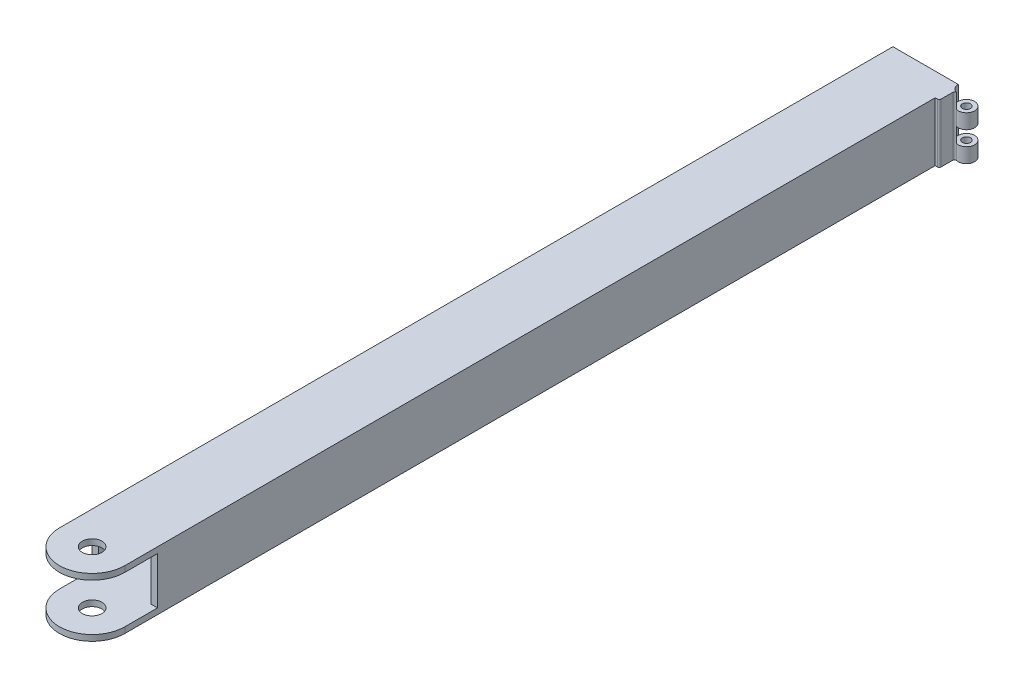
ISO-10303-21;
HEADER;
FILE_DESCRIPTION(('STEP AP214'),'2;1');
FILE_NAME('part.step','',(''),(''),'','','');
FILE_SCHEMA(('AUTOMOTIVE_DESIGN { 1 0 10303 214 1 1 1 1 }'));
ENDSEC;
DATA;
#1=APPLICATION_CONTEXT('core data for automotive mechanical design processes');
#2=APPLICATION_PROTOCOL_DEFINITION('international standard','automotive_design',2000,#1);
#3=PRODUCT_CONTEXT('',#1,'mechanical');
#4=PRODUCT('Part','Part','',(#3));
#5=PRODUCT_RELATED_PRODUCT_CATEGORY('part','',(#4));
#6=PRODUCT_DEFINITION_FORMATION('','',#4);
#7=PRODUCT_DEFINITION_CONTEXT('part definition',#1,'design');
#8=PRODUCT_DEFINITION('design','',#6,#7);
#9=PRODUCT_DEFINITION_SHAPE('','',#8);
#10=(LENGTH_UNIT() NAMED_UNIT(*) SI_UNIT(.MILLI.,.METRE.));
#11=(NAMED_UNIT(*) PLANE_ANGLE_UNIT() SI_UNIT($,.RADIAN.));
#12=(NAMED_UNIT(*) SI_UNIT($,.STERADIAN.) SOLID_ANGLE_UNIT());
#13=UNCERTAINTY_MEASURE_WITH_UNIT(LENGTH_MEASURE(1.E-05),#10,'distance_accuracy_value','');
#14=(GEOMETRIC_REPRESENTATION_CONTEXT(3) GLOBAL_UNCERTAINTY_ASSIGNED_CONTEXT((#13)) GLOBAL_UNIT_ASSIGNED_CONTEXT((#10,
#11,#12)) REPRESENTATION_CONTEXT('',''));
#15=CARTESIAN_POINT('',(0.,0.,0.));
#16=DIRECTION('',(0.,0.,1.));
#17=DIRECTION('',(1.,0.,0.));
#18=AXIS2_PLACEMENT_3D('',#15,#16,#17);
#19=CARTESIAN_POINT('',(25.,18.,0.));
#20=DIRECTION('',(0.,-1.,0.));
#21=DIRECTION('',(0.,0.,-1.));
#22=AXIS2_PLACEMENT_3D('',#19,#20,#21);
#23=CYLINDRICAL_SURFACE('',#22,5.);
#24=DIRECTION('',(0.,-1.,0.));
#25=VECTOR('',#24,1.);
#26=CARTESIAN_POINT('',(23.75,18.,4.84122918275927));
#27=LINE('',#26,#25);
#28=CARTESIAN_POINT('',(23.75,9.,4.84122918275927));
#29=VERTEX_POINT('',#28);
#30=CARTESIAN_POINT('',(23.75,0.,4.84122918275927));
#31=VERTEX_POINT('',#30);
#32=EDGE_CURVE('E215',#29,#31,#27,.T.);
#33=ORIENTED_EDGE('',*,*,#32,.T.);
#34=CARTESIAN_POINT('',(25.,0.,0.));
#35=DIRECTION('',(0.,-1.,0.));
#36=DIRECTION('',(0.,0.,-1.));
#37=AXIS2_PLACEMENT_3D('',#34,#35,#36);
#38=CIRCLE('',#37,5.);
#39=CARTESIAN_POINT('',(20.,0.,0.));
#40=VERTEX_POINT('',#39);
#41=EDGE_CURVE('E224',#40,#31,#38,.T.);
#42=ORIENTED_EDGE('',*,*,#41,.F.);
#43=DIRECTION('',(0.,1.,0.));
#44=VECTOR('',#43,1.);
#45=CARTESIAN_POINT('',(20.,18.,0.));
#46=LINE('',#45,#44);
#47=CARTESIAN_POINT('',(20.,9.,0.));
#48=VERTEX_POINT('',#47);
#49=EDGE_CURVE('E423',#40,#48,#46,.T.);
#50=ORIENTED_EDGE('',*,*,#49,.T.);
#51=CARTESIAN_POINT('',(25.,9.,0.));
#52=DIRECTION('',(0.,1.,0.));
#53=DIRECTION('',(0.,0.,1.));
#54=AXIS2_PLACEMENT_3D('',#51,#52,#53);
#55=CIRCLE('',#54,5.);
#56=EDGE_CURVE('E258',#29,#48,#55,.T.);
#57=ORIENTED_EDGE('',*,*,#56,.F.);
#58=EDGE_LOOP('',(#33,#42,#50,#57));
#59=FACE_BOUND('',#58,.T.);
#60=ADVANCED_FACE('F45',(#59),#23,.T.);
#61=CARTESIAN_POINT('',(25.,18.,0.));
#62=DIRECTION('',(0.,-1.,0.));
#63=DIRECTION('',(0.,0.,-1.));
#64=AXIS2_PLACEMENT_3D('',#61,#62,#63);
#65=CYLINDRICAL_SURFACE('',#64,2.5);
#66=CARTESIAN_POINT('',(25.,9.,0.));
#67=DIRECTION('',(0.,1.,0.));
#68=DIRECTION('',(0.,0.,1.));
#69=AXIS2_PLACEMENT_3D('',#66,#67,#68);
#70=CIRCLE('',#69,2.5);
#71=CARTESIAN_POINT('',(25.,9.,2.5));
#72=VERTEX_POINT('',#71);
#73=EDGE_CURVE('E650',#72,#72,#70,.F.);
#74=ORIENTED_EDGE('',*,*,#73,.F.);
#75=EDGE_LOOP('',(#74));
#76=FACE_BOUND('',#75,.T.);
#77=CARTESIAN_POINT('',(25.,0.,0.));
#78=DIRECTION('',(0.,-1.,0.));
#79=DIRECTION('',(0.,0.,-1.));
#80=AXIS2_PLACEMENT_3D('',#77,#78,#79);
#81=CIRCLE('',#80,2.5);
#82=CARTESIAN_POINT('',(25.,0.,-2.5));
#83=VERTEX_POINT('',#82);
#84=EDGE_CURVE('E665',#83,#83,#81,.F.);
#85=ORIENTED_EDGE('',*,*,#84,.F.);
#86=EDGE_LOOP('',(#85));
#87=FACE_BOUND('',#86,.T.);
#88=ADVANCED_FACE('F535',(#76,#87),#65,.F.);
#89=CARTESIAN_POINT('',(25.,-9.,0.));
#90=DIRECTION('',(0.,-1.,0.));
#91=DIRECTION('',(0.,0.,-1.));
#92=AXIS2_PLACEMENT_3D('',#89,#90,#91);
#93=CIRCLE('',#92,5.);
#94=CARTESIAN_POINT('',(20.,-9.,0.));
#95=VERTEX_POINT('',#94);
#96=CARTESIAN_POINT('',(23.75,-9.,4.84122918275927));
#97=VERTEX_POINT('',#96);
#98=EDGE_CURVE('E222',#95,#97,#93,.T.);
#99=ORIENTED_EDGE('',*,*,#98,.T.);
#100=CARTESIAN_POINT('',(23.75,-18.,4.84122918275927));
#101=VERTEX_POINT('',#100);
#102=EDGE_CURVE('E216',#97,#101,#27,.T.);
#103=ORIENTED_EDGE('',*,*,#102,.T.);
#104=CARTESIAN_POINT('',(25.,-18.,0.));
#105=DIRECTION('',(0.,-1.,0.));
#106=DIRECTION('',(0.,0.,-1.));
#107=AXIS2_PLACEMENT_3D('',#104,#105,#106);
#108=CIRCLE('',#107,5.);
#109=CARTESIAN_POINT('',(20.,-18.,0.));
#110=VERTEX_POINT('',#109);
#111=EDGE_CURVE('E309',#110,#101,#108,.T.);
#112=ORIENTED_EDGE('',*,*,#111,.F.);
#113=EDGE_CURVE('E231',#110,#95,#46,.T.);
#114=ORIENTED_EDGE('',*,*,#113,.T.);
#115=EDGE_LOOP('',(#99,#103,#112,#114));
#116=FACE_BOUND('',#115,.T.);
#117=ADVANCED_FACE('F228',(#116),#23,.T.);
#118=CARTESIAN_POINT('',(25.,-9.,0.));
#119=DIRECTION('',(0.,-1.,0.));
#120=DIRECTION('',(0.,0.,-1.));
#121=AXIS2_PLACEMENT_3D('',#118,#119,#120);
#122=CIRCLE('',#121,2.5);
#123=CARTESIAN_POINT('',(25.,-9.,-2.5));
#124=VERTEX_POINT('',#123);
#125=EDGE_CURVE('E669',#124,#124,#122,.F.);
#126=ORIENTED_EDGE('',*,*,#125,.T.);
#127=EDGE_LOOP('',(#126));
#128=FACE_BOUND('',#127,.T.);
#129=CARTESIAN_POINT('',(25.,-18.,0.));
#130=DIRECTION('',(0.,-1.,0.));
#131=DIRECTION('',(0.,0.,-1.));
#132=AXIS2_PLACEMENT_3D('',#129,#130,#131);
#133=CIRCLE('',#132,2.5);
#134=CARTESIAN_POINT('',(25.,-18.,-2.5));
#135=VERTEX_POINT('',#134);
#136=EDGE_CURVE('E306',#135,#135,#133,.T.);
#137=ORIENTED_EDGE('',*,*,#136,.T.);
#138=EDGE_LOOP('',(#137));
#139=FACE_BOUND('',#138,.T.);
#140=ADVANCED_FACE('F542',(#128,#139),#65,.F.);
#141=CARTESIAN_POINT('',(0.,14.4,510.));
#142=DIRECTION('',(0.,-1.,0.));
#143=DIRECTION('',(1.,0.,0.));
#144=AXIS2_PLACEMENT_3D('',#141,#142,#143);
#145=CYLINDRICAL_SURFACE('',#144,20.);
#146=DIRECTION('',(0.,1.,0.));
#147=VECTOR('',#146,1.);
#148=CARTESIAN_POINT('',(-20.,14.4,510.));
#149=LINE('',#148,#147);
#150=CARTESIAN_POINT('',(-20.,14.4,510.));
#151=VERTEX_POINT('',#150);
#152=CARTESIAN_POINT('',(-20.,18.,510.));
#153=VERTEX_POINT('',#152);
#154=EDGE_CURVE('E464',#151,#153,#149,.T.);
#155=ORIENTED_EDGE('',*,*,#154,.F.);
#156=CARTESIAN_POINT('',(0.,14.4,510.));
#157=DIRECTION('',(0.,-1.,0.));
#158=DIRECTION('',(0.,0.,-1.));
#159=AXIS2_PLACEMENT_3D('',#156,#157,#158);
#160=CIRCLE('',#159,20.);
#161=CARTESIAN_POINT('',(20.,14.4,510.));
#162=VERTEX_POINT('',#161);
#163=EDGE_CURVE('E472',#162,#151,#160,.T.);
#164=ORIENTED_EDGE('',*,*,#163,.F.);
#165=DIRECTION('',(0.,1.,0.));
#166=VECTOR('',#165,1.);
#167=CARTESIAN_POINT('',(20.,14.4,510.));
#168=LINE('',#167,#166);
#169=CARTESIAN_POINT('',(20.,18.,510.));
#170=VERTEX_POINT('',#169);
#171=EDGE_CURVE('E468',#170,#162,#168,.F.);
#172=ORIENTED_EDGE('',*,*,#171,.F.);
#173=CARTESIAN_POINT('',(0.,18.,510.));
#174=DIRECTION('',(0.,-1.,0.));
#175=DIRECTION('',(0.,0.,-1.));
#176=AXIS2_PLACEMENT_3D('',#173,#174,#175);
#177=CIRCLE('',#176,20.);
#178=EDGE_CURVE('E475',#153,#170,#177,.F.);
#179=ORIENTED_EDGE('',*,*,#178,.F.);
#180=EDGE_LOOP('',(#155,#164,#172,#179));
#181=FACE_BOUND('',#180,.T.);
#182=ADVANCED_FACE('F549',(#181),#145,.T.);
#183=CARTESIAN_POINT('',(0.,-18.,510.));
#184=DIRECTION('',(0.,-1.,0.));
#185=DIRECTION('',(1.,0.,0.));
#186=AXIS2_PLACEMENT_3D('',#183,#184,#185);
#187=CYLINDRICAL_SURFACE('',#186,20.);
#188=DIRECTION('',(0.,1.,0.));
#189=VECTOR('',#188,1.);
#190=CARTESIAN_POINT('',(-20.,-18.,510.));
#191=LINE('',#190,#189);
#192=CARTESIAN_POINT('',(-20.,-18.,510.));
#193=VERTEX_POINT('',#192);
#194=CARTESIAN_POINT('',(-20.,-14.4,510.));
#195=VERTEX_POINT('',#194);
#196=EDGE_CURVE('E450',#193,#195,#191,.T.);
#197=ORIENTED_EDGE('',*,*,#196,.F.);
#198=CARTESIAN_POINT('',(0.,-18.,510.));
#199=DIRECTION('',(0.,1.,0.));
#200=DIRECTION('',(0.,0.,1.));
#201=AXIS2_PLACEMENT_3D('',#198,#199,#200);
#202=CIRCLE('',#201,20.);
#203=CARTESIAN_POINT('',(20.,-18.,510.));
#204=VERTEX_POINT('',#203);
#205=EDGE_CURVE('E458',#204,#193,#202,.F.);
#206=ORIENTED_EDGE('',*,*,#205,.F.);
#207=DIRECTION('',(0.,1.,0.));
#208=VECTOR('',#207,1.);
#209=CARTESIAN_POINT('',(20.,-18.,510.));
#210=LINE('',#209,#208);
#211=CARTESIAN_POINT('',(20.,-14.4,510.));
#212=VERTEX_POINT('',#211);
#213=EDGE_CURVE('E454',#212,#204,#210,.F.);
#214=ORIENTED_EDGE('',*,*,#213,.F.);
#215=CARTESIAN_POINT('',(0.,-14.4,510.));
#216=DIRECTION('',(0.,1.,0.));
#217=DIRECTION('',(-1.,0.,0.));
#218=AXIS2_PLACEMENT_3D('',#215,#216,#217);
#219=CIRCLE('',#218,20.);
#220=EDGE_CURVE('E461',#195,#212,#219,.T.);
#221=ORIENTED_EDGE('',*,*,#220,.F.);
#222=EDGE_LOOP('',(#197,#206,#214,#221));
#223=FACE_BOUND('',#222,.T.);
#224=ADVANCED_FACE('F554',(#223),#187,.T.);
#225=CARTESIAN_POINT('',(0.,0.,0.));
#226=DIRECTION('',(0.,0.,1.));
#227=DIRECTION('',(1.,0.,0.));
#228=AXIS2_PLACEMENT_3D('',#225,#226,#227);
#229=PLANE('',#228);
#230=ORIENTED_EDGE('',*,*,#113,.F.);
#231=DIRECTION('',(1.,0.,0.));
#232=VECTOR('',#231,1.);
#233=CARTESIAN_POINT('',(-20.,-18.,0.));
#234=LINE('',#233,#232);
#235=CARTESIAN_POINT('',(-20.,-18.,0.));
#236=VERTEX_POINT('',#235);
#237=EDGE_CURVE('E434',#236,#110,#234,.T.);
#238=ORIENTED_EDGE('',*,*,#237,.F.);
#239=DIRECTION('',(0.,-1.,0.));
#240=VECTOR('',#239,1.);
#241=CARTESIAN_POINT('',(-20.,18.,0.));
#242=LINE('',#241,#240);
#243=CARTESIAN_POINT('',(-20.,18.,0.));
#244=VERTEX_POINT('',#243);
#245=EDGE_CURVE('E430',#244,#236,#242,.T.);
#246=ORIENTED_EDGE('',*,*,#245,.F.);
#247=DIRECTION('',(-1.,0.,0.));
#248=VECTOR('',#247,1.);
#249=CARTESIAN_POINT('',(-20.,18.,0.));
#250=LINE('',#249,#248);
#251=CARTESIAN_POINT('',(20.,18.,0.));
#252=VERTEX_POINT('',#251);
#253=EDGE_CURVE('E426',#252,#244,#250,.T.);
#254=ORIENTED_EDGE('',*,*,#253,.F.);
#255=DIRECTION('',(0.,1.,0.));
#256=VECTOR('',#255,1.);
#257=CARTESIAN_POINT('',(20.,9.,0.));
#258=LINE('',#257,#256);
#259=EDGE_CURVE('E648',#252,#48,#258,.F.);
#260=ORIENTED_EDGE('',*,*,#259,.T.);
#261=ORIENTED_EDGE('',*,*,#49,.F.);
#262=DIRECTION('',(0.,-1.,0.));
#263=VECTOR('',#262,1.);
#264=CARTESIAN_POINT('',(20.,0.,0.));
#265=LINE('',#264,#263);
#266=EDGE_CURVE('E661',#40,#95,#265,.T.);
#267=ORIENTED_EDGE('',*,*,#266,.T.);
#268=EDGE_LOOP('',(#230,#238,#246,#254,#260,#261,#267));
#269=FACE_BOUND('',#268,.T.);
#270=DIRECTION('',(0.,1.,0.));
#271=VECTOR('',#270,1.);
#272=CARTESIAN_POINT('',(16.,14.4,0.));
#273=LINE('',#272,#271);
#274=CARTESIAN_POINT('',(16.,-14.4,0.));
#275=VERTEX_POINT('',#274);
#276=CARTESIAN_POINT('',(16.,14.4,0.));
#277=VERTEX_POINT('',#276);
#278=EDGE_CURVE('E395',#275,#277,#273,.T.);
#279=ORIENTED_EDGE('',*,*,#278,.T.);
#280=DIRECTION('',(-1.,0.,0.));
#281=VECTOR('',#280,1.);
#282=CARTESIAN_POINT('',(-16.,14.4,0.));
#283=LINE('',#282,#281);
#284=CARTESIAN_POINT('',(-16.,14.4,0.));
#285=VERTEX_POINT('',#284);
#286=EDGE_CURVE('E399',#277,#285,#283,.T.);
#287=ORIENTED_EDGE('',*,*,#286,.T.);
#288=DIRECTION('',(0.,-1.,0.));
#289=VECTOR('',#288,1.);
#290=CARTESIAN_POINT('',(-16.,14.4,0.));
#291=LINE('',#290,#289);
#292=CARTESIAN_POINT('',(-16.,-14.4,0.));
#293=VERTEX_POINT('',#292);
#294=EDGE_CURVE('E403',#285,#293,#291,.T.);
#295=ORIENTED_EDGE('',*,*,#294,.T.);
#296=DIRECTION('',(1.,0.,0.));
#297=VECTOR('',#296,1.);
#298=CARTESIAN_POINT('',(-16.,-14.4,0.));
#299=LINE('',#298,#297);
#300=EDGE_CURVE('E407',#293,#275,#299,.T.);
#301=ORIENTED_EDGE('',*,*,#300,.T.);
#302=EDGE_LOOP('',(#279,#287,#295,#301));
#303=FACE_BOUND('',#302,.T.);
#304=ADVANCED_FACE('F580',(#269,#303),#229,.F.);
#305=CARTESIAN_POINT('',(20.,18.,530.));
#306=DIRECTION('',(-1.,0.,0.));
#307=DIRECTION('',(0.,-1.,0.));
#308=AXIS2_PLACEMENT_3D('',#305,#306,#307);
#309=PLANE('',#308);
#310=DIRECTION('',(0.,0.,-1.));
#311=VECTOR('',#310,1.);
#312=CARTESIAN_POINT('',(20.,-18.,530.));
#313=LINE('',#312,#311);
#314=CARTESIAN_POINT('',(20.,-18.,14.1206935243212));
#315=VERTEX_POINT('',#314);
#316=EDGE_CURVE('E438',#204,#315,#313,.T.);
#317=ORIENTED_EDGE('',*,*,#316,.T.);
#318=DIRECTION('',(0.,-1.,0.));
#319=VECTOR('',#318,1.);
#320=CARTESIAN_POINT('',(20.,18.,14.1206935243212));
#321=LINE('',#320,#319);
#322=CARTESIAN_POINT('',(20.,18.,14.1206935243212));
#323=VERTEX_POINT('',#322);
#324=EDGE_CURVE('E290',#323,#315,#321,.T.);
#325=ORIENTED_EDGE('',*,*,#324,.F.);
#326=DIRECTION('',(0.,0.,-1.));
#327=VECTOR('',#326,1.);
#328=CARTESIAN_POINT('',(20.,18.,530.));
#329=LINE('',#328,#327);
#330=EDGE_CURVE('E447',#170,#323,#329,.T.);
#331=ORIENTED_EDGE('',*,*,#330,.F.);
#332=ORIENTED_EDGE('',*,*,#171,.T.);
#333=DIRECTION('',(0.,0.,-1.));
#334=VECTOR('',#333,1.);
#335=CARTESIAN_POINT('',(20.,14.4,530.));
#336=LINE('',#335,#334);
#337=CARTESIAN_POINT('',(20.,14.4,490.));
#338=VERTEX_POINT('',#337);
#339=EDGE_CURVE('E385',#162,#338,#336,.T.);
#340=ORIENTED_EDGE('',*,*,#339,.T.);
#341=DIRECTION('',(0.,-1.,0.));
#342=VECTOR('',#341,1.);
#343=CARTESIAN_POINT('',(20.,18.,490.));
#344=LINE('',#343,#342);
#345=CARTESIAN_POINT('',(20.,-14.4,490.));
#346=VERTEX_POINT('',#345);
#347=EDGE_CURVE('E377',#338,#346,#344,.T.);
#348=ORIENTED_EDGE('',*,*,#347,.T.);
#349=DIRECTION('',(0.,0.,1.));
#350=VECTOR('',#349,1.);
#351=CARTESIAN_POINT('',(20.,-14.4,530.));
#352=LINE('',#351,#350);
#353=EDGE_CURVE('E391',#346,#212,#352,.T.);
#354=ORIENTED_EDGE('',*,*,#353,.T.);
#355=ORIENTED_EDGE('',*,*,#213,.T.);
#356=EDGE_LOOP('',(#317,#325,#331,#332,#340,#348,#354,#355));
#357=FACE_BOUND('',#356,.T.);
#358=ADVANCED_FACE('F582',(#357),#309,.F.);
#359=CARTESIAN_POINT('',(-20.,18.,530.));
#360=DIRECTION('',(0.,-1.,0.));
#361=DIRECTION('',(0.,0.,-1.));
#362=AXIS2_PLACEMENT_3D('',#359,#360,#361);
#363=PLANE('',#362);
#364=CARTESIAN_POINT('',(0.,18.,510.));
#365=DIRECTION('',(0.,-1.,0.));
#366=DIRECTION('',(0.,0.,-1.));
#367=AXIS2_PLACEMENT_3D('',#364,#365,#366);
#368=CIRCLE('',#367,6.);
#369=CARTESIAN_POINT('',(0.,18.,504.));
#370=VERTEX_POINT('',#369);
#371=EDGE_CURVE('E353',#370,#370,#368,.T.);
#372=ORIENTED_EDGE('',*,*,#371,.T.);
#373=EDGE_LOOP('',(#372));
#374=FACE_BOUND('',#373,.T.);
#375=CARTESIAN_POINT('',(23.5,18.,5.80947501931113));
#376=DIRECTION('',(0.,-1.,0.));
#377=DIRECTION('',(0.,0.,-1.));
#378=AXIS2_PLACEMENT_3D('',#375,#376,#377);
#379=CIRCLE('',#378,1.);
#380=CARTESIAN_POINT('',(22.5,18.,5.80947501931113));
#381=VERTEX_POINT('',#380);
#382=CARTESIAN_POINT('',(23.75,18.,4.84122918275927));
#383=VERTEX_POINT('',#382);
#384=EDGE_CURVE('E260',#381,#383,#379,.T.);
#385=ORIENTED_EDGE('',*,*,#384,.T.);
#386=CARTESIAN_POINT('',(25.,18.,0.));
#387=DIRECTION('',(0.,1.,0.));
#388=DIRECTION('',(0.,0.,1.));
#389=AXIS2_PLACEMENT_3D('',#386,#387,#388);
#390=CIRCLE('',#389,5.);
#391=EDGE_CURVE('E646',#252,#383,#390,.T.);
#392=ORIENTED_EDGE('',*,*,#391,.F.);
#393=ORIENTED_EDGE('',*,*,#253,.T.);
#394=DIRECTION('',(0.,0.,-1.));
#395=VECTOR('',#394,1.);
#396=CARTESIAN_POINT('',(-20.,18.,530.));
#397=LINE('',#396,#395);
#398=EDGE_CURVE('E444',#153,#244,#397,.T.);
#399=ORIENTED_EDGE('',*,*,#398,.F.);
#400=ORIENTED_EDGE('',*,*,#178,.T.);
#401=ORIENTED_EDGE('',*,*,#330,.T.);
#402=DIRECTION('',(-1.,0.,0.));
#403=VECTOR('',#402,1.);
#404=CARTESIAN_POINT('',(20.,18.,14.1206935243212));
#405=LINE('',#404,#403);
#406=CARTESIAN_POINT('',(21.5,18.,14.1206935243212));
#407=VERTEX_POINT('',#406);
#408=EDGE_CURVE('E298',#407,#323,#405,.T.);
#409=ORIENTED_EDGE('',*,*,#408,.F.);
#410=CARTESIAN_POINT('',(21.5,18.,13.1206935243212));
#411=DIRECTION('',(0.,-1.,0.));
#412=DIRECTION('',(0.,0.,-1.));
#413=AXIS2_PLACEMENT_3D('',#410,#411,#412);
#414=CIRCLE('',#413,1.);
#415=CARTESIAN_POINT('',(22.5,18.,13.1206935243212));
#416=VERTEX_POINT('',#415);
#417=EDGE_CURVE('E11',#407,#416,#414,.F.);
#418=ORIENTED_EDGE('',*,*,#417,.T.);
#419=DIRECTION('',(0.,0.,1.));
#420=VECTOR('',#419,1.);
#421=CARTESIAN_POINT('',(22.5,18.,14.1206935243212));
#422=LINE('',#421,#420);
#423=EDGE_CURVE('E292',#381,#416,#422,.T.);
#424=ORIENTED_EDGE('',*,*,#423,.F.);
#425=EDGE_LOOP('',(#385,#392,#393,#399,#400,#401,#409,#418,#424));
#426=FACE_BOUND('',#425,.T.);
#427=ADVANCED_FACE('F296',(#374,#426),#363,.F.);
#428=CARTESIAN_POINT('',(-20.,18.,530.));
#429=DIRECTION('',(1.,0.,0.));
#430=DIRECTION('',(0.,1.,0.));
#431=AXIS2_PLACEMENT_3D('',#428,#429,#430);
#432=PLANE('',#431);
#433=DIRECTION('',(0.,0.,1.));
#434=VECTOR('',#433,1.);
#435=CARTESIAN_POINT('',(-20.,14.4,530.));
#436=LINE('',#435,#434);
#437=CARTESIAN_POINT('',(-20.,14.4,490.));
#438=VERTEX_POINT('',#437);
#439=EDGE_CURVE('E381',#438,#151,#436,.T.);
#440=ORIENTED_EDGE('',*,*,#439,.T.);
#441=ORIENTED_EDGE('',*,*,#154,.T.);
#442=ORIENTED_EDGE('',*,*,#398,.T.);
#443=ORIENTED_EDGE('',*,*,#245,.T.);
#444=DIRECTION('',(0.,0.,-1.));
#445=VECTOR('',#444,1.);
#446=CARTESIAN_POINT('',(-20.,-18.,530.));
#447=LINE('',#446,#445);
#448=EDGE_CURVE('E441',#193,#236,#447,.T.);
#449=ORIENTED_EDGE('',*,*,#448,.F.);
#450=ORIENTED_EDGE('',*,*,#196,.T.);
#451=DIRECTION('',(0.,0.,-1.));
#452=VECTOR('',#451,1.);
#453=CARTESIAN_POINT('',(-20.,-14.4,530.));
#454=LINE('',#453,#452);
#455=CARTESIAN_POINT('',(-20.,-14.4,490.));
#456=VERTEX_POINT('',#455);
#457=EDGE_CURVE('E388',#195,#456,#454,.T.);
#458=ORIENTED_EDGE('',*,*,#457,.T.);
#459=DIRECTION('',(0.,1.,0.));
#460=VECTOR('',#459,1.);
#461=CARTESIAN_POINT('',(-20.,18.,490.));
#462=LINE('',#461,#460);
#463=EDGE_CURVE('E373',#456,#438,#462,.T.);
#464=ORIENTED_EDGE('',*,*,#463,.T.);
#465=EDGE_LOOP('',(#440,#441,#442,#443,#449,#450,#458,#464));
#466=FACE_BOUND('',#465,.T.);
#467=ADVANCED_FACE('F515',(#466),#432,.F.);
#468=CARTESIAN_POINT('',(-20.,-18.,530.));
#469=DIRECTION('',(0.,1.,0.));
#470=DIRECTION('',(0.,0.,1.));
#471=AXIS2_PLACEMENT_3D('',#468,#469,#470);
#472=PLANE('',#471);
#473=CARTESIAN_POINT('',(0.,-18.,360.));
#474=DIRECTION('',(0.,-1.,0.));
#475=DIRECTION('',(0.,0.,-1.));
#476=AXIS2_PLACEMENT_3D('',#473,#474,#475);
#477=CIRCLE('',#476,6.);
#478=CARTESIAN_POINT('',(-5.99999999999999,-18.,360.));
#479=VERTEX_POINT('',#478);
#480=CARTESIAN_POINT('',(6.,-18.,360.));
#481=VERTEX_POINT('',#480);
#482=EDGE_CURVE('E319',#479,#481,#477,.T.);
#483=ORIENTED_EDGE('',*,*,#482,.F.);
#484=DIRECTION('',(0.,0.,-1.));
#485=VECTOR('',#484,1.);
#486=CARTESIAN_POINT('',(-5.99999999999993,-18.,0.));
#487=LINE('',#486,#485);
#488=CARTESIAN_POINT('',(-6.,-18.,460.));
#489=VERTEX_POINT('',#488);
#490=EDGE_CURVE('E316',#489,#479,#487,.T.);
#491=ORIENTED_EDGE('',*,*,#490,.F.);
#492=CARTESIAN_POINT('',(0.,-18.,460.));
#493=DIRECTION('',(0.,-1.,0.));
#494=DIRECTION('',(0.,0.,-1.));
#495=AXIS2_PLACEMENT_3D('',#492,#493,#494);
#496=CIRCLE('',#495,6.00000000000001);
#497=CARTESIAN_POINT('',(6.00000000000001,-18.,460.));
#498=VERTEX_POINT('',#497);
#499=EDGE_CURVE('E327',#498,#489,#496,.T.);
#500=ORIENTED_EDGE('',*,*,#499,.F.);
#501=DIRECTION('',(0.,0.,-1.));
#502=VECTOR('',#501,1.);
#503=CARTESIAN_POINT('',(5.99999999999993,-18.,0.));
#504=LINE('',#503,#502);
#505=EDGE_CURVE('E323',#498,#481,#504,.T.);
#506=ORIENTED_EDGE('',*,*,#505,.T.);
#507=EDGE_LOOP('',(#483,#491,#500,#506));
#508=FACE_BOUND('',#507,.T.);
#509=CARTESIAN_POINT('',(0.,-18.,510.));
#510=DIRECTION('',(0.,1.,0.));
#511=DIRECTION('',(0.,0.,1.));
#512=AXIS2_PLACEMENT_3D('',#509,#510,#511);
#513=CIRCLE('',#512,6.);
#514=CARTESIAN_POINT('',(0.,-18.,516.));
#515=VERTEX_POINT('',#514);
#516=EDGE_CURVE('E335',#515,#515,#513,.T.);
#517=ORIENTED_EDGE('',*,*,#516,.T.);
#518=EDGE_LOOP('',(#517));
#519=FACE_BOUND('',#518,.T.);
#520=DIRECTION('',(0.,0.,1.));
#521=VECTOR('',#520,1.);
#522=CARTESIAN_POINT('',(22.5,-18.,14.1206935243212));
#523=LINE('',#522,#521);
#524=CARTESIAN_POINT('',(22.5,-18.,5.80947501931113));
#525=VERTEX_POINT('',#524);
#526=CARTESIAN_POINT('',(22.5,-18.,13.1206935243212));
#527=VERTEX_POINT('',#526);
#528=EDGE_CURVE('E284',#525,#527,#523,.T.);
#529=ORIENTED_EDGE('',*,*,#528,.T.);
#530=CARTESIAN_POINT('',(21.5,-18.,13.1206935243212));
#531=DIRECTION('',(0.,1.,0.));
#532=DIRECTION('',(0.,0.,1.));
#533=AXIS2_PLACEMENT_3D('',#530,#531,#532);
#534=CIRCLE('',#533,1.);
#535=CARTESIAN_POINT('',(21.5,-18.,14.1206935243212));
#536=VERTEX_POINT('',#535);
#537=EDGE_CURVE('E270',#527,#536,#534,.F.);
#538=ORIENTED_EDGE('',*,*,#537,.T.);
#539=DIRECTION('',(-1.,0.,0.));
#540=VECTOR('',#539,1.);
#541=CARTESIAN_POINT('',(20.,-18.,14.1206935243212));
#542=LINE('',#541,#540);
#543=EDGE_CURVE('E281',#536,#315,#542,.T.);
#544=ORIENTED_EDGE('',*,*,#543,.T.);
#545=ORIENTED_EDGE('',*,*,#316,.F.);
#546=ORIENTED_EDGE('',*,*,#205,.T.);
#547=ORIENTED_EDGE('',*,*,#448,.T.);
#548=ORIENTED_EDGE('',*,*,#237,.T.);
#549=ORIENTED_EDGE('',*,*,#111,.T.);
#550=CARTESIAN_POINT('',(23.5,-18.,5.80947501931113));
#551=DIRECTION('',(0.,1.,0.));
#552=DIRECTION('',(0.,0.,1.));
#553=AXIS2_PLACEMENT_3D('',#550,#551,#552);
#554=CIRCLE('',#553,1.);
#555=EDGE_CURVE('E236',#101,#525,#554,.T.);
#556=ORIENTED_EDGE('',*,*,#555,.T.);
#557=EDGE_LOOP('',(#529,#538,#544,#545,#546,#547,#548,#549,#556));
#558=FACE_BOUND('',#557,.T.);
#559=ORIENTED_EDGE('',*,*,#136,.F.);
#560=EDGE_LOOP('',(#559));
#561=FACE_BOUND('',#560,.T.);
#562=ADVANCED_FACE('F278',(#508,#519,#558,#561),#472,.F.);
#563=CARTESIAN_POINT('',(16.,14.4,530.));
#564=DIRECTION('',(-1.,0.,0.));
#565=DIRECTION('',(0.,-1.,0.));
#566=AXIS2_PLACEMENT_3D('',#563,#564,#565);
#567=PLANE('',#566);
#568=DIRECTION('',(0.,-1.,0.));
#569=VECTOR('',#568,1.);
#570=CARTESIAN_POINT('',(16.,14.4,490.));
#571=LINE('',#570,#569);
#572=CARTESIAN_POINT('',(16.,14.4,490.));
#573=VERTEX_POINT('',#572);
#574=CARTESIAN_POINT('',(16.,-14.4,490.));
#575=VERTEX_POINT('',#574);
#576=EDGE_CURVE('E370',#573,#575,#571,.T.);
#577=ORIENTED_EDGE('',*,*,#576,.F.);
#578=DIRECTION('',(0.,0.,-1.));
#579=VECTOR('',#578,1.);
#580=CARTESIAN_POINT('',(16.,14.4,530.));
#581=LINE('',#580,#579);
#582=EDGE_CURVE('E420',#573,#277,#581,.T.);
#583=ORIENTED_EDGE('',*,*,#582,.T.);
#584=ORIENTED_EDGE('',*,*,#278,.F.);
#585=DIRECTION('',(0.,0.,-1.));
#586=VECTOR('',#585,1.);
#587=CARTESIAN_POINT('',(16.,-14.4,530.));
#588=LINE('',#587,#586);
#589=EDGE_CURVE('E411',#575,#275,#588,.T.);
#590=ORIENTED_EDGE('',*,*,#589,.F.);
#591=EDGE_LOOP('',(#577,#583,#584,#590));
#592=FACE_BOUND('',#591,.T.);
#593=ADVANCED_FACE('F514',(#592),#567,.T.);
#594=CARTESIAN_POINT('',(-16.,14.4,530.));
#595=DIRECTION('',(0.,-1.,0.));
#596=DIRECTION('',(0.,0.,-1.));
#597=AXIS2_PLACEMENT_3D('',#594,#595,#596);
#598=PLANE('',#597);
#599=CARTESIAN_POINT('',(0.,14.4,510.));
#600=DIRECTION('',(0.,-1.,0.));
#601=DIRECTION('',(0.,0.,-1.));
#602=AXIS2_PLACEMENT_3D('',#599,#600,#601);
#603=CIRCLE('',#602,6.);
#604=CARTESIAN_POINT('',(0.,14.4,504.));
#605=VERTEX_POINT('',#604);
#606=EDGE_CURVE('E349',#605,#605,#603,.T.);
#607=ORIENTED_EDGE('',*,*,#606,.F.);
#608=EDGE_LOOP('',(#607));
#609=FACE_BOUND('',#608,.T.);
#610=ORIENTED_EDGE('',*,*,#339,.F.);
#611=ORIENTED_EDGE('',*,*,#163,.T.);
#612=ORIENTED_EDGE('',*,*,#439,.F.);
#613=DIRECTION('',(-1.,0.,0.));
#614=VECTOR('',#613,1.);
#615=CARTESIAN_POINT('',(-25.,14.4,490.));
#616=LINE('',#615,#614);
#617=CARTESIAN_POINT('',(-16.,14.4,490.));
#618=VERTEX_POINT('',#617);
#619=EDGE_CURVE('E357',#618,#438,#616,.T.);
#620=ORIENTED_EDGE('',*,*,#619,.F.);
#621=DIRECTION('',(0.,0.,-1.));
#622=VECTOR('',#621,1.);
#623=CARTESIAN_POINT('',(-16.,14.4,530.));
#624=LINE('',#623,#622);
#625=EDGE_CURVE('E417',#618,#285,#624,.T.);
#626=ORIENTED_EDGE('',*,*,#625,.T.);
#627=ORIENTED_EDGE('',*,*,#286,.F.);
#628=ORIENTED_EDGE('',*,*,#582,.F.);
#629=EDGE_CURVE('E361',#338,#573,#616,.T.);
#630=ORIENTED_EDGE('',*,*,#629,.F.);
#631=EDGE_LOOP('',(#610,#611,#612,#620,#626,#627,#628,#630));
#632=FACE_BOUND('',#631,.T.);
#633=ADVANCED_FACE('F597',(#609,#632),#598,.T.);
#634=CARTESIAN_POINT('',(-16.,14.4,530.));
#635=DIRECTION('',(1.,0.,0.));
#636=DIRECTION('',(0.,1.,0.));
#637=AXIS2_PLACEMENT_3D('',#634,#635,#636);
#638=PLANE('',#637);
#639=DIRECTION('',(0.,1.,0.));
#640=VECTOR('',#639,1.);
#641=CARTESIAN_POINT('',(-16.,14.4,490.));
#642=LINE('',#641,#640);
#643=CARTESIAN_POINT('',(-16.,-14.4,490.));
#644=VERTEX_POINT('',#643);
#645=EDGE_CURVE('E367',#644,#618,#642,.T.);
#646=ORIENTED_EDGE('',*,*,#645,.F.);
#647=DIRECTION('',(0.,0.,-1.));
#648=VECTOR('',#647,1.);
#649=CARTESIAN_POINT('',(-16.,-14.4,530.));
#650=LINE('',#649,#648);
#651=EDGE_CURVE('E414',#644,#293,#650,.T.);
#652=ORIENTED_EDGE('',*,*,#651,.T.);
#653=ORIENTED_EDGE('',*,*,#294,.F.);
#654=ORIENTED_EDGE('',*,*,#625,.F.);
#655=EDGE_LOOP('',(#646,#652,#653,#654));
#656=FACE_BOUND('',#655,.T.);
#657=ADVANCED_FACE('F601',(#656),#638,.T.);
#658=CARTESIAN_POINT('',(-16.,-14.4,530.));
#659=DIRECTION('',(0.,1.,0.));
#660=DIRECTION('',(-1.,0.,0.));
#661=AXIS2_PLACEMENT_3D('',#658,#659,#660);
#662=PLANE('',#661);
#663=DIRECTION('',(0.,0.,1.));
#664=VECTOR('',#663,1.);
#665=CARTESIAN_POINT('',(-6.,-14.4,530.));
#666=LINE('',#665,#664);
#667=CARTESIAN_POINT('',(-5.99999999999999,-14.4,360.));
#668=VERTEX_POINT('',#667);
#669=CARTESIAN_POINT('',(-6.,-14.4,460.));
#670=VERTEX_POINT('',#669);
#671=EDGE_CURVE('E239',#668,#670,#666,.T.);
#672=ORIENTED_EDGE('',*,*,#671,.F.);
#673=CARTESIAN_POINT('',(0.,-14.4,360.));
#674=DIRECTION('',(0.,1.,0.));
#675=DIRECTION('',(-1.,0.,0.));
#676=AXIS2_PLACEMENT_3D('',#673,#674,#675);
#677=CIRCLE('',#676,6.);
#678=CARTESIAN_POINT('',(6.00000000000002,-14.4,360.));
#679=VERTEX_POINT('',#678);
#680=EDGE_CURVE('E478',#679,#668,#677,.T.);
#681=ORIENTED_EDGE('',*,*,#680,.F.);
#682=DIRECTION('',(0.,0.,1.));
#683=VECTOR('',#682,1.);
#684=CARTESIAN_POINT('',(6.,-14.4,530.));
#685=LINE('',#684,#683);
#686=CARTESIAN_POINT('',(6.00000000000001,-14.4,460.));
#687=VERTEX_POINT('',#686);
#688=EDGE_CURVE('E484',#679,#687,#685,.T.);
#689=ORIENTED_EDGE('',*,*,#688,.T.);
#690=CARTESIAN_POINT('',(0.,-14.4,460.));
#691=DIRECTION('',(0.,1.,0.));
#692=DIRECTION('',(-1.,0.,0.));
#693=AXIS2_PLACEMENT_3D('',#690,#691,#692);
#694=CIRCLE('',#693,6.00000000000001);
#695=EDGE_CURVE('E242',#670,#687,#694,.T.);
#696=ORIENTED_EDGE('',*,*,#695,.F.);
#697=EDGE_LOOP('',(#672,#681,#689,#696));
#698=FACE_BOUND('',#697,.T.);
#699=CARTESIAN_POINT('',(0.,-14.4,510.));
#700=DIRECTION('',(0.,1.,0.));
#701=DIRECTION('',(-1.,0.,0.));
#702=AXIS2_PLACEMENT_3D('',#699,#700,#701);
#703=CIRCLE('',#702,6.);
#704=CARTESIAN_POINT('',(-6.,-14.4,510.));
#705=VERTEX_POINT('',#704);
#706=EDGE_CURVE('E348',#705,#705,#703,.T.);
#707=ORIENTED_EDGE('',*,*,#706,.F.);
#708=EDGE_LOOP('',(#707));
#709=FACE_BOUND('',#708,.T.);
#710=ORIENTED_EDGE('',*,*,#457,.F.);
#711=ORIENTED_EDGE('',*,*,#220,.T.);
#712=ORIENTED_EDGE('',*,*,#353,.F.);
#713=DIRECTION('',(1.,0.,0.));
#714=VECTOR('',#713,1.);
#715=CARTESIAN_POINT('',(-25.,-14.4,490.));
#716=LINE('',#715,#714);
#717=EDGE_CURVE('E362',#575,#346,#716,.T.);
#718=ORIENTED_EDGE('',*,*,#717,.F.);
#719=ORIENTED_EDGE('',*,*,#589,.T.);
#720=ORIENTED_EDGE('',*,*,#300,.F.);
#721=ORIENTED_EDGE('',*,*,#651,.F.);
#722=EDGE_CURVE('E366',#456,#644,#716,.T.);
#723=ORIENTED_EDGE('',*,*,#722,.F.);
#724=EDGE_LOOP('',(#710,#711,#712,#718,#719,#720,#721,#723));
#725=FACE_BOUND('',#724,.T.);
#726=ADVANCED_FACE('F502',(#698,#709,#725),#662,.T.);
#727=CARTESIAN_POINT('',(0.,0.,490.));
#728=DIRECTION('',(0.,0.,-1.));
#729=DIRECTION('',(-1.,0.,0.));
#730=AXIS2_PLACEMENT_3D('',#727,#728,#729);
#731=PLANE('',#730);
#732=ORIENTED_EDGE('',*,*,#722,.T.);
#733=ORIENTED_EDGE('',*,*,#645,.T.);
#734=ORIENTED_EDGE('',*,*,#619,.T.);
#735=ORIENTED_EDGE('',*,*,#463,.F.);
#736=EDGE_LOOP('',(#732,#733,#734,#735));
#737=FACE_BOUND('',#736,.T.);
#738=ADVANCED_FACE('F530',(#737),#731,.F.);
#739=ORIENTED_EDGE('',*,*,#629,.T.);
#740=ORIENTED_EDGE('',*,*,#576,.T.);
#741=ORIENTED_EDGE('',*,*,#717,.T.);
#742=ORIENTED_EDGE('',*,*,#347,.F.);
#743=EDGE_LOOP('',(#739,#740,#741,#742));
#744=FACE_BOUND('',#743,.T.);
#745=ADVANCED_FACE('F522',(#744),#731,.F.);
#746=CARTESIAN_POINT('',(0.,-18.,510.));
#747=DIRECTION('',(0.,1.,0.));
#748=DIRECTION('',(0.,0.,1.));
#749=AXIS2_PLACEMENT_3D('',#746,#747,#748);
#750=CYLINDRICAL_SURFACE('',#749,6.);
#751=ORIENTED_EDGE('',*,*,#706,.T.);
#752=EDGE_LOOP('',(#751));
#753=FACE_BOUND('',#752,.T.);
#754=ORIENTED_EDGE('',*,*,#516,.F.);
#755=EDGE_LOOP('',(#754));
#756=FACE_BOUND('',#755,.T.);
#757=ADVANCED_FACE('F519',(#753,#756),#750,.F.);
#758=ORIENTED_EDGE('',*,*,#606,.T.);
#759=EDGE_LOOP('',(#758));
#760=FACE_BOUND('',#759,.T.);
#761=ORIENTED_EDGE('',*,*,#371,.F.);
#762=EDGE_LOOP('',(#761));
#763=FACE_BOUND('',#762,.T.);
#764=ADVANCED_FACE('F521',(#760,#763),#750,.F.);
#765=CARTESIAN_POINT('',(-5.99999999999993,-8.,0.));
#766=DIRECTION('',(-1.,0.,0.));
#767=DIRECTION('',(0.,0.,1.));
#768=AXIS2_PLACEMENT_3D('',#765,#766,#767);
#769=PLANE('',#768);
#770=ORIENTED_EDGE('',*,*,#671,.T.);
#771=DIRECTION('',(0.,-1.,0.));
#772=VECTOR('',#771,1.);
#773=CARTESIAN_POINT('',(-6.,-8.,460.));
#774=LINE('',#773,#772);
#775=EDGE_CURVE('E332',#670,#489,#774,.T.);
#776=ORIENTED_EDGE('',*,*,#775,.T.);
#777=ORIENTED_EDGE('',*,*,#490,.T.);
#778=DIRECTION('',(0.,-1.,0.));
#779=VECTOR('',#778,1.);
#780=CARTESIAN_POINT('',(-5.99999999999999,-8.,360.));
#781=LINE('',#780,#779);
#782=EDGE_CURVE('E331',#668,#479,#781,.T.);
#783=ORIENTED_EDGE('',*,*,#782,.F.);
#784=EDGE_LOOP('',(#770,#776,#777,#783));
#785=FACE_BOUND('',#784,.T.);
#786=ADVANCED_FACE('F509',(#785),#769,.F.);
#787=CARTESIAN_POINT('',(0.,-8.,460.));
#788=DIRECTION('',(0.,-1.,0.));
#789=DIRECTION('',(0.,0.,-1.));
#790=AXIS2_PLACEMENT_3D('',#787,#788,#789);
#791=CYLINDRICAL_SURFACE('',#790,6.00000000000001);
#792=ORIENTED_EDGE('',*,*,#695,.T.);
#793=DIRECTION('',(0.,-1.,0.));
#794=VECTOR('',#793,1.);
#795=CARTESIAN_POINT('',(6.00000000000001,-8.,460.));
#796=LINE('',#795,#794);
#797=EDGE_CURVE('E336',#687,#498,#796,.T.);
#798=ORIENTED_EDGE('',*,*,#797,.T.);
#799=ORIENTED_EDGE('',*,*,#499,.T.);
#800=ORIENTED_EDGE('',*,*,#775,.F.);
#801=EDGE_LOOP('',(#792,#798,#799,#800));
#802=FACE_BOUND('',#801,.T.);
#803=ADVANCED_FACE('F493',(#802),#791,.F.);
#804=CARTESIAN_POINT('',(5.99999999999993,-8.,0.));
#805=DIRECTION('',(-1.,0.,0.));
#806=DIRECTION('',(0.,0.,1.));
#807=AXIS2_PLACEMENT_3D('',#804,#805,#806);
#808=PLANE('',#807);
#809=DIRECTION('',(0.,-1.,0.));
#810=VECTOR('',#809,1.);
#811=CARTESIAN_POINT('',(6.,-8.,360.));
#812=LINE('',#811,#810);
#813=EDGE_CURVE('E339',#679,#481,#812,.T.);
#814=ORIENTED_EDGE('',*,*,#813,.T.);
#815=ORIENTED_EDGE('',*,*,#505,.F.);
#816=ORIENTED_EDGE('',*,*,#797,.F.);
#817=ORIENTED_EDGE('',*,*,#688,.F.);
#818=EDGE_LOOP('',(#814,#815,#816,#817));
#819=FACE_BOUND('',#818,.T.);
#820=ADVANCED_FACE('F499',(#819),#808,.T.);
#821=CARTESIAN_POINT('',(0.,-8.,360.));
#822=DIRECTION('',(0.,-1.,0.));
#823=DIRECTION('',(0.,0.,-1.));
#824=AXIS2_PLACEMENT_3D('',#821,#822,#823);
#825=CYLINDRICAL_SURFACE('',#824,6.);
#826=ORIENTED_EDGE('',*,*,#680,.T.);
#827=ORIENTED_EDGE('',*,*,#782,.T.);
#828=ORIENTED_EDGE('',*,*,#482,.T.);
#829=ORIENTED_EDGE('',*,*,#813,.F.);
#830=EDGE_LOOP('',(#826,#827,#828,#829));
#831=FACE_BOUND('',#830,.T.);
#832=ADVANCED_FACE('F506',(#831),#825,.F.);
#833=CARTESIAN_POINT('',(20.,18.,14.1206935243212));
#834=DIRECTION('',(0.,0.,1.));
#835=DIRECTION('',(1.,0.,0.));
#836=AXIS2_PLACEMENT_3D('',#833,#834,#835);
#837=PLANE('',#836);
#838=ORIENTED_EDGE('',*,*,#543,.F.);
#839=DIRECTION('',(0.,-1.,0.));
#840=VECTOR('',#839,1.);
#841=CARTESIAN_POINT('',(21.5,18.,14.1206935243212));
#842=LINE('',#841,#840);
#843=EDGE_CURVE('E54',#536,#407,#842,.F.);
#844=ORIENTED_EDGE('',*,*,#843,.T.);
#845=ORIENTED_EDGE('',*,*,#408,.T.);
#846=ORIENTED_EDGE('',*,*,#324,.T.);
#847=EDGE_LOOP('',(#838,#844,#845,#846));
#848=FACE_BOUND('',#847,.T.);
#849=ADVANCED_FACE('F288',(#848),#837,.T.);
#850=CARTESIAN_POINT('',(22.5,18.,14.1206935243212));
#851=DIRECTION('',(1.,0.,0.));
#852=DIRECTION('',(0.,0.,-1.));
#853=AXIS2_PLACEMENT_3D('',#850,#851,#852);
#854=PLANE('',#853);
#855=ORIENTED_EDGE('',*,*,#423,.T.);
#856=DIRECTION('',(0.,-1.,0.));
#857=VECTOR('',#856,1.);
#858=CARTESIAN_POINT('',(22.5,18.,13.1206935243212));
#859=LINE('',#858,#857);
#860=EDGE_CURVE('E265',#416,#527,#859,.T.);
#861=ORIENTED_EDGE('',*,*,#860,.T.);
#862=ORIENTED_EDGE('',*,*,#528,.F.);
#863=DIRECTION('',(0.,1.,0.));
#864=VECTOR('',#863,1.);
#865=CARTESIAN_POINT('',(22.5,18.,5.80947501931113));
#866=LINE('',#865,#864);
#867=EDGE_CURVE('E246',#525,#381,#866,.T.);
#868=ORIENTED_EDGE('',*,*,#867,.T.);
#869=EDGE_LOOP('',(#855,#861,#862,#868));
#870=FACE_BOUND('',#869,.T.);
#871=ADVANCED_FACE('F300',(#870),#854,.T.);
#872=CARTESIAN_POINT('',(23.5,18.,5.80947501931113));
#873=DIRECTION('',(0.,-1.,0.));
#874=DIRECTION('',(0.,0.,-1.));
#875=AXIS2_PLACEMENT_3D('',#872,#873,#874);
#876=CYLINDRICAL_SURFACE('',#875,1.);
#877=ORIENTED_EDGE('',*,*,#384,.F.);
#878=ORIENTED_EDGE('',*,*,#867,.F.);
#879=ORIENTED_EDGE('',*,*,#555,.F.);
#880=ORIENTED_EDGE('',*,*,#102,.F.);
#881=EDGE_CURVE('E205',#31,#97,#27,.T.);
#882=ORIENTED_EDGE('',*,*,#881,.F.);
#883=ORIENTED_EDGE('',*,*,#32,.F.);
#884=EDGE_CURVE('E240',#383,#29,#27,.T.);
#885=ORIENTED_EDGE('',*,*,#884,.F.);
#886=EDGE_LOOP('',(#877,#878,#879,#880,#882,#883,#885));
#887=FACE_BOUND('',#886,.T.);
#888=ADVANCED_FACE('F234',(#887),#876,.F.);
#889=CARTESIAN_POINT('',(21.5,18.,13.1206935243212));
#890=DIRECTION('',(0.,-1.,0.));
#891=DIRECTION('',(0.,0.,-1.));
#892=AXIS2_PLACEMENT_3D('',#889,#890,#891);
#893=CYLINDRICAL_SURFACE('',#892,1.);
#894=ORIENTED_EDGE('',*,*,#417,.F.);
#895=ORIENTED_EDGE('',*,*,#843,.F.);
#896=ORIENTED_EDGE('',*,*,#537,.F.);
#897=ORIENTED_EDGE('',*,*,#860,.F.);
#898=EDGE_LOOP('',(#894,#895,#896,#897));
#899=FACE_BOUND('',#898,.T.);
#900=ADVANCED_FACE('F47',(#899),#893,.T.);
#901=CARTESIAN_POINT('',(25.,9.,0.));
#902=DIRECTION('',(0.,1.,0.));
#903=DIRECTION('',(0.,0.,1.));
#904=AXIS2_PLACEMENT_3D('',#901,#902,#903);
#905=CYLINDRICAL_SURFACE('',#904,5.);
#906=ORIENTED_EDGE('',*,*,#391,.T.);
#907=ORIENTED_EDGE('',*,*,#884,.T.);
#908=EDGE_CURVE('E644',#48,#29,#55,.T.);
#909=ORIENTED_EDGE('',*,*,#908,.F.);
#910=ORIENTED_EDGE('',*,*,#259,.F.);
#911=EDGE_LOOP('',(#906,#907,#909,#910));
#912=FACE_BOUND('',#911,.T.);
#913=ADVANCED_FACE('F561',(#912),#905,.F.);
#914=CARTESIAN_POINT('',(25.,9.,0.));
#915=DIRECTION('',(0.,1.,0.));
#916=DIRECTION('',(0.,0.,1.));
#917=AXIS2_PLACEMENT_3D('',#914,#915,#916);
#918=PLANE('',#917);
#919=ORIENTED_EDGE('',*,*,#908,.T.);
#920=ORIENTED_EDGE('',*,*,#56,.T.);
#921=EDGE_LOOP('',(#919,#920));
#922=FACE_BOUND('',#921,.T.);
#923=ORIENTED_EDGE('',*,*,#73,.T.);
#924=EDGE_LOOP('',(#923));
#925=FACE_BOUND('',#924,.T.);
#926=ADVANCED_FACE('F642',(#922,#925),#918,.T.);
#927=CARTESIAN_POINT('',(25.,0.,0.));
#928=DIRECTION('',(0.,-1.,0.));
#929=DIRECTION('',(0.,0.,-1.));
#930=AXIS2_PLACEMENT_3D('',#927,#928,#929);
#931=CYLINDRICAL_SURFACE('',#930,5.);
#932=EDGE_CURVE('E61',#31,#40,#38,.T.);
#933=ORIENTED_EDGE('',*,*,#932,.F.);
#934=ORIENTED_EDGE('',*,*,#881,.T.);
#935=EDGE_CURVE('E208',#97,#95,#93,.T.);
#936=ORIENTED_EDGE('',*,*,#935,.T.);
#937=ORIENTED_EDGE('',*,*,#266,.F.);
#938=EDGE_LOOP('',(#933,#934,#936,#937));
#939=FACE_BOUND('',#938,.T.);
#940=ADVANCED_FACE('F207',(#939),#931,.F.);
#941=CARTESIAN_POINT('',(25.,0.,0.));
#942=DIRECTION('',(0.,-1.,0.));
#943=DIRECTION('',(0.,0.,-1.));
#944=AXIS2_PLACEMENT_3D('',#941,#942,#943);
#945=PLANE('',#944);
#946=ORIENTED_EDGE('',*,*,#932,.T.);
#947=ORIENTED_EDGE('',*,*,#41,.T.);
#948=EDGE_LOOP('',(#946,#947));
#949=FACE_BOUND('',#948,.T.);
#950=ORIENTED_EDGE('',*,*,#84,.T.);
#951=EDGE_LOOP('',(#950));
#952=FACE_BOUND('',#951,.T.);
#953=ADVANCED_FACE('F675',(#949,#952),#945,.T.);
#954=CARTESIAN_POINT('',(25.,-9.,0.));
#955=DIRECTION('',(0.,-1.,0.));
#956=DIRECTION('',(0.,0.,-1.));
#957=AXIS2_PLACEMENT_3D('',#954,#955,#956);
#958=PLANE('',#957);
#959=ORIENTED_EDGE('',*,*,#935,.F.);
#960=ORIENTED_EDGE('',*,*,#98,.F.);
#961=EDGE_LOOP('',(#959,#960));
#962=FACE_BOUND('',#961,.T.);
#963=ORIENTED_EDGE('',*,*,#125,.F.);
#964=EDGE_LOOP('',(#963));
#965=FACE_BOUND('',#964,.T.);
#966=ADVANCED_FACE('F220',(#962,#965),#958,.F.);
#967=CLOSED_SHELL('',(#60,#88,#117,#140,#182,#224,#304,#358,#427,#467,#562,#593,#633,#657,#726,
#738,#745,#757,#764,#786,#803,#820,#832,#849,#871,#888,#900,#913,#926,#940,#953,#966));
#968=MANIFOLD_SOLID_BREP('B2',#967);
#969=ADVANCED_BREP_SHAPE_REPRESENTATION('',(#18,#968),#14);
#970=SHAPE_DEFINITION_REPRESENTATION(#9,#969);
ENDSEC;
END-ISO-10303-21;
